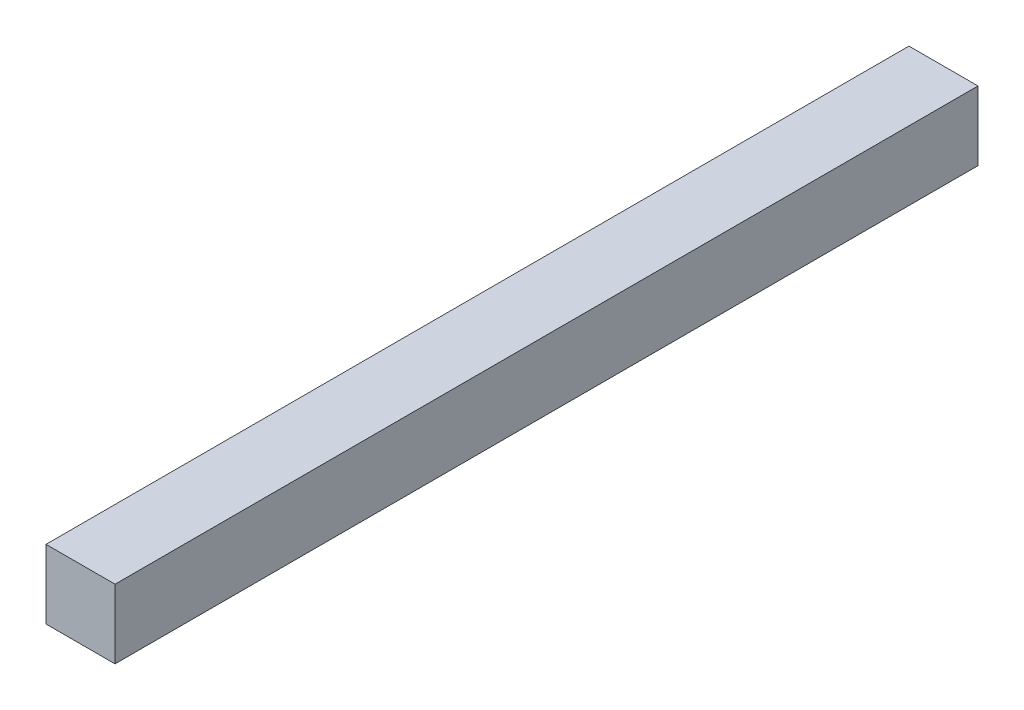
ISO-10303-21;
HEADER;
FILE_DESCRIPTION(('STEP AP214'),'2;1');
FILE_NAME('part.step','',(''),(''),'','','');
FILE_SCHEMA(('AUTOMOTIVE_DESIGN { 1 0 10303 214 1 1 1 1 }'));
ENDSEC;
DATA;
#1=APPLICATION_CONTEXT('core data for automotive mechanical design processes');
#2=APPLICATION_PROTOCOL_DEFINITION('international standard','automotive_design',2000,#1);
#3=PRODUCT_CONTEXT('',#1,'mechanical');
#4=PRODUCT('Part','Part','',(#3));
#5=PRODUCT_RELATED_PRODUCT_CATEGORY('part','',(#4));
#6=PRODUCT_DEFINITION_FORMATION('','',#4);
#7=PRODUCT_DEFINITION_CONTEXT('part definition',#1,'design');
#8=PRODUCT_DEFINITION('design','',#6,#7);
#9=PRODUCT_DEFINITION_SHAPE('','',#8);
#10=(LENGTH_UNIT() NAMED_UNIT(*) SI_UNIT(.MILLI.,.METRE.));
#11=(NAMED_UNIT(*) PLANE_ANGLE_UNIT() SI_UNIT($,.RADIAN.));
#12=(NAMED_UNIT(*) SI_UNIT($,.STERADIAN.) SOLID_ANGLE_UNIT());
#13=UNCERTAINTY_MEASURE_WITH_UNIT(LENGTH_MEASURE(1.E-05),#10,'distance_accuracy_value','');
#14=(GEOMETRIC_REPRESENTATION_CONTEXT(3) GLOBAL_UNCERTAINTY_ASSIGNED_CONTEXT((#13)) GLOBAL_UNIT_ASSIGNED_CONTEXT((#10,
#11,#12)) REPRESENTATION_CONTEXT('',''));
#15=CARTESIAN_POINT('',(0.,0.,0.));
#16=DIRECTION('',(0.,0.,1.));
#17=DIRECTION('',(1.,0.,0.));
#18=AXIS2_PLACEMENT_3D('',#15,#16,#17);
#19=CARTESIAN_POINT('',(-2.4,-2.4,60.));
#20=DIRECTION('',(1.,0.,0.));
#21=DIRECTION('',(0.,0.,-1.));
#22=AXIS2_PLACEMENT_3D('',#19,#20,#21);
#23=PLANE('',#22);
#24=DIRECTION('',(0.,-1.,0.));
#25=VECTOR('',#24,1.);
#26=CARTESIAN_POINT('',(-2.4,-2.4,0.));
#27=LINE('',#26,#25);
#28=CARTESIAN_POINT('',(-2.4,2.4,0.));
#29=VERTEX_POINT('',#28);
#30=CARTESIAN_POINT('',(-2.4,-2.4,0.));
#31=VERTEX_POINT('',#30);
#32=EDGE_CURVE('E113',#29,#31,#27,.T.);
#33=ORIENTED_EDGE('',*,*,#32,.T.);
#34=DIRECTION('',(0.,0.,-1.));
#35=VECTOR('',#34,1.);
#36=CARTESIAN_POINT('',(-2.4,-2.4,60.));
#37=LINE('',#36,#35);
#38=CARTESIAN_POINT('',(-2.4,-2.4,60.));
#39=VERTEX_POINT('',#38);
#40=EDGE_CURVE('E11',#39,#31,#37,.T.);
#41=ORIENTED_EDGE('',*,*,#40,.F.);
#42=DIRECTION('',(0.,-1.,0.));
#43=VECTOR('',#42,1.);
#44=CARTESIAN_POINT('',(-2.4,-2.4,60.));
#45=LINE('',#44,#43);
#46=CARTESIAN_POINT('',(-2.4,2.4,60.));
#47=VERTEX_POINT('',#46);
#48=EDGE_CURVE('E97',#47,#39,#45,.T.);
#49=ORIENTED_EDGE('',*,*,#48,.F.);
#50=DIRECTION('',(0.,0.,-1.));
#51=VECTOR('',#50,1.);
#52=CARTESIAN_POINT('',(-2.4,2.4,60.));
#53=LINE('',#52,#51);
#54=EDGE_CURVE('E109',#47,#29,#53,.T.);
#55=ORIENTED_EDGE('',*,*,#54,.T.);
#56=EDGE_LOOP('',(#33,#41,#49,#55));
#57=FACE_BOUND('',#56,.T.);
#58=ADVANCED_FACE('F45',(#57),#23,.F.);
#59=CARTESIAN_POINT('',(2.4,-2.4,60.));
#60=DIRECTION('',(0.,1.,0.));
#61=DIRECTION('',(-1.,0.,0.));
#62=AXIS2_PLACEMENT_3D('',#59,#60,#61);
#63=PLANE('',#62);
#64=DIRECTION('',(1.,0.,0.));
#65=VECTOR('',#64,1.);
#66=CARTESIAN_POINT('',(2.4,-2.4,0.));
#67=LINE('',#66,#65);
#68=CARTESIAN_POINT('',(2.4,-2.4,0.));
#69=VERTEX_POINT('',#68);
#70=EDGE_CURVE('E102',#31,#69,#67,.T.);
#71=ORIENTED_EDGE('',*,*,#70,.T.);
#72=DIRECTION('',(0.,0.,-1.));
#73=VECTOR('',#72,1.);
#74=CARTESIAN_POINT('',(2.4,-2.4,60.));
#75=LINE('',#74,#73);
#76=CARTESIAN_POINT('',(2.4,-2.4,60.));
#77=VERTEX_POINT('',#76);
#78=EDGE_CURVE('E54',#77,#69,#75,.T.);
#79=ORIENTED_EDGE('',*,*,#78,.F.);
#80=DIRECTION('',(1.,0.,0.));
#81=VECTOR('',#80,1.);
#82=CARTESIAN_POINT('',(2.4,-2.4,60.));
#83=LINE('',#82,#81);
#84=EDGE_CURVE('E92',#39,#77,#83,.T.);
#85=ORIENTED_EDGE('',*,*,#84,.F.);
#86=ORIENTED_EDGE('',*,*,#40,.T.);
#87=EDGE_LOOP('',(#71,#79,#85,#86));
#88=FACE_BOUND('',#87,.T.);
#89=ADVANCED_FACE('F101',(#88),#63,.F.);
#90=CARTESIAN_POINT('',(2.4,-2.4,60.));
#91=DIRECTION('',(-1.,0.,0.));
#92=DIRECTION('',(0.,0.,1.));
#93=AXIS2_PLACEMENT_3D('',#90,#91,#92);
#94=PLANE('',#93);
#95=DIRECTION('',(0.,1.,0.));
#96=VECTOR('',#95,1.);
#97=CARTESIAN_POINT('',(2.4,-2.4,0.));
#98=LINE('',#97,#96);
#99=CARTESIAN_POINT('',(2.4,2.4,0.));
#100=VERTEX_POINT('',#99);
#101=EDGE_CURVE('E79',#69,#100,#98,.T.);
#102=ORIENTED_EDGE('',*,*,#101,.T.);
#103=DIRECTION('',(0.,0.,-1.));
#104=VECTOR('',#103,1.);
#105=CARTESIAN_POINT('',(2.4,2.4,60.));
#106=LINE('',#105,#104);
#107=CARTESIAN_POINT('',(2.4,2.4,60.));
#108=VERTEX_POINT('',#107);
#109=EDGE_CURVE('E104',#108,#100,#106,.T.);
#110=ORIENTED_EDGE('',*,*,#109,.F.);
#111=DIRECTION('',(0.,1.,0.));
#112=VECTOR('',#111,1.);
#113=CARTESIAN_POINT('',(2.4,-2.4,60.));
#114=LINE('',#113,#112);
#115=EDGE_CURVE('E95',#77,#108,#114,.T.);
#116=ORIENTED_EDGE('',*,*,#115,.F.);
#117=ORIENTED_EDGE('',*,*,#78,.T.);
#118=EDGE_LOOP('',(#102,#110,#116,#117));
#119=FACE_BOUND('',#118,.T.);
#120=ADVANCED_FACE('F105',(#119),#94,.F.);
#121=CARTESIAN_POINT('',(2.4,2.4,60.));
#122=DIRECTION('',(0.,-1.,0.));
#123=DIRECTION('',(1.,0.,0.));
#124=AXIS2_PLACEMENT_3D('',#121,#122,#123);
#125=PLANE('',#124);
#126=DIRECTION('',(-1.,0.,0.));
#127=VECTOR('',#126,1.);
#128=CARTESIAN_POINT('',(2.4,2.4,0.));
#129=LINE('',#128,#127);
#130=EDGE_CURVE('E85',#100,#29,#129,.T.);
#131=ORIENTED_EDGE('',*,*,#130,.T.);
#132=ORIENTED_EDGE('',*,*,#54,.F.);
#133=DIRECTION('',(-1.,0.,0.));
#134=VECTOR('',#133,1.);
#135=CARTESIAN_POINT('',(2.4,2.4,60.));
#136=LINE('',#135,#134);
#137=EDGE_CURVE('E62',#108,#47,#136,.T.);
#138=ORIENTED_EDGE('',*,*,#137,.F.);
#139=ORIENTED_EDGE('',*,*,#109,.T.);
#140=EDGE_LOOP('',(#131,#132,#138,#139));
#141=FACE_BOUND('',#140,.T.);
#142=ADVANCED_FACE('F126',(#141),#125,.F.);
#143=CARTESIAN_POINT('',(0.,0.,60.));
#144=DIRECTION('',(0.,0.,1.));
#145=DIRECTION('',(1.,0.,0.));
#146=AXIS2_PLACEMENT_3D('',#143,#144,#145);
#147=PLANE('',#146);
#148=ORIENTED_EDGE('',*,*,#48,.T.);
#149=ORIENTED_EDGE('',*,*,#84,.T.);
#150=ORIENTED_EDGE('',*,*,#115,.T.);
#151=ORIENTED_EDGE('',*,*,#137,.T.);
#152=EDGE_LOOP('',(#148,#149,#150,#151));
#153=FACE_BOUND('',#152,.T.);
#154=ADVANCED_FACE('F93',(#153),#147,.T.);
#155=CARTESIAN_POINT('',(0.,0.,0.));
#156=DIRECTION('',(0.,0.,1.));
#157=DIRECTION('',(1.,0.,0.));
#158=AXIS2_PLACEMENT_3D('',#155,#156,#157);
#159=PLANE('',#158);
#160=ORIENTED_EDGE('',*,*,#32,.F.);
#161=ORIENTED_EDGE('',*,*,#130,.F.);
#162=ORIENTED_EDGE('',*,*,#101,.F.);
#163=ORIENTED_EDGE('',*,*,#70,.F.);
#164=EDGE_LOOP('',(#160,#161,#162,#163));
#165=FACE_BOUND('',#164,.T.);
#166=ADVANCED_FACE('F129',(#165),#159,.F.);
#167=CLOSED_SHELL('',(#58,#89,#120,#142,#154,#166));
#168=MANIFOLD_SOLID_BREP('B2',#167);
#169=ADVANCED_BREP_SHAPE_REPRESENTATION('',(#18,#168),#14);
#170=SHAPE_DEFINITION_REPRESENTATION(#9,#169);
ENDSEC;
END-ISO-10303-21;
